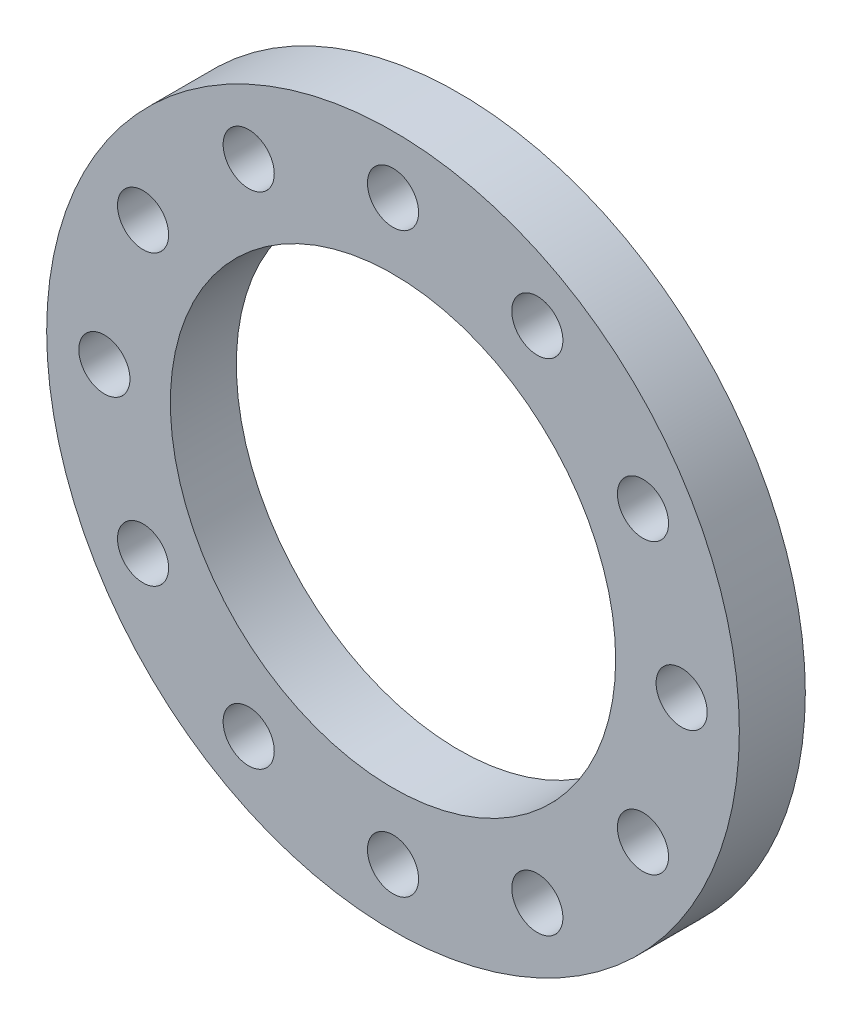
ISO-10303-21;
HEADER;
FILE_DESCRIPTION(('STEP AP214'),'2;1');
FILE_NAME('part.step','',(''),(''),'','','');
FILE_SCHEMA(('AUTOMOTIVE_DESIGN { 1 0 10303 214 1 1 1 1 }'));
ENDSEC;
DATA;
#1=APPLICATION_CONTEXT('core data for automotive mechanical design processes');
#2=APPLICATION_PROTOCOL_DEFINITION('international standard','automotive_design',2000,#1);
#3=PRODUCT_CONTEXT('',#1,'mechanical');
#4=PRODUCT('Part','Part','',(#3));
#5=PRODUCT_RELATED_PRODUCT_CATEGORY('part','',(#4));
#6=PRODUCT_DEFINITION_FORMATION('','',#4);
#7=PRODUCT_DEFINITION_CONTEXT('part definition',#1,'design');
#8=PRODUCT_DEFINITION('design','',#6,#7);
#9=PRODUCT_DEFINITION_SHAPE('','',#8);
#10=(LENGTH_UNIT() NAMED_UNIT(*) SI_UNIT(.MILLI.,.METRE.));
#11=(NAMED_UNIT(*) PLANE_ANGLE_UNIT() SI_UNIT($,.RADIAN.));
#12=(NAMED_UNIT(*) SI_UNIT($,.STERADIAN.) SOLID_ANGLE_UNIT());
#13=UNCERTAINTY_MEASURE_WITH_UNIT(LENGTH_MEASURE(1.E-05),#10,'distance_accuracy_value','');
#14=(GEOMETRIC_REPRESENTATION_CONTEXT(3) GLOBAL_UNCERTAINTY_ASSIGNED_CONTEXT((#13)) GLOBAL_UNIT_ASSIGNED_CONTEXT((#10,
#11,#12)) REPRESENTATION_CONTEXT('',''));
#15=CARTESIAN_POINT('',(0.,0.,0.));
#16=DIRECTION('',(0.,0.,1.));
#17=DIRECTION('',(1.,0.,0.));
#18=AXIS2_PLACEMENT_3D('',#15,#16,#17);
#19=CARTESIAN_POINT('',(0.,0.,4.));
#20=DIRECTION('',(0.,0.,1.));
#21=DIRECTION('',(1.,0.,0.));
#22=AXIS2_PLACEMENT_3D('',#19,#20,#21);
#23=PLANE('',#22);
#24=CARTESIAN_POINT('',(15.1554445662292,8.74999999999743,4.));
#25=DIRECTION('',(0.,0.,1.));
#26=DIRECTION('',(1.,0.,0.));
#27=AXIS2_PLACEMENT_3D('',#24,#25,#26);
#28=CIRCLE('',#27,1.55);
#29=CARTESIAN_POINT('',(16.7054445662292,8.74999999999743,4.));
#30=VERTEX_POINT('',#29);
#31=EDGE_CURVE('E132',#30,#30,#28,.T.);
#32=ORIENTED_EDGE('',*,*,#31,.F.);
#33=EDGE_LOOP('',(#32));
#34=FACE_BOUND('',#33,.T.);
#35=CARTESIAN_POINT('',(-15.1554445662262,-8.75000000000258,4.));
#36=DIRECTION('',(0.,0.,1.));
#37=DIRECTION('',(1.,0.,0.));
#38=AXIS2_PLACEMENT_3D('',#35,#36,#37);
#39=CIRCLE('',#38,1.55);
#40=CARTESIAN_POINT('',(-13.6054445662262,-8.75000000000258,4.));
#41=VERTEX_POINT('',#40);
#42=EDGE_CURVE('E117',#41,#41,#39,.T.);
#43=ORIENTED_EDGE('',*,*,#42,.F.);
#44=EDGE_LOOP('',(#43));
#45=FACE_BOUND('',#44,.T.);
#46=CARTESIAN_POINT('',(-15.1554445662247,8.75,4.));
#47=DIRECTION('',(0.,0.,1.));
#48=DIRECTION('',(1.,0.,0.));
#49=AXIS2_PLACEMENT_3D('',#46,#47,#48);
#50=CIRCLE('',#49,1.55);
#51=CARTESIAN_POINT('',(-13.6054445662247,8.75,4.));
#52=VERTEX_POINT('',#51);
#53=EDGE_CURVE('E101',#52,#52,#50,.T.);
#54=ORIENTED_EDGE('',*,*,#53,.F.);
#55=EDGE_LOOP('',(#54));
#56=FACE_BOUND('',#55,.T.);
#57=CARTESIAN_POINT('',(15.1554445662306,-8.75,4.));
#58=DIRECTION('',(0.,0.,1.));
#59=DIRECTION('',(1.,0.,0.));
#60=AXIS2_PLACEMENT_3D('',#57,#58,#59);
#61=CIRCLE('',#60,1.55);
#62=CARTESIAN_POINT('',(16.7054445662307,-8.75,4.));
#63=VERTEX_POINT('',#62);
#64=EDGE_CURVE('E88',#63,#63,#61,.T.);
#65=ORIENTED_EDGE('',*,*,#64,.F.);
#66=EDGE_LOOP('',(#65));
#67=FACE_BOUND('',#66,.T.);
#68=CARTESIAN_POINT('',(0.,-17.5,4.));
#69=DIRECTION('',(0.,0.,1.));
#70=DIRECTION('',(1.,0.,0.));
#71=AXIS2_PLACEMENT_3D('',#68,#69,#70);
#72=CIRCLE('',#71,1.55);
#73=CARTESIAN_POINT('',(1.55,-17.5,4.));
#74=VERTEX_POINT('',#73);
#75=EDGE_CURVE('E71',#74,#74,#72,.T.);
#76=ORIENTED_EDGE('',*,*,#75,.F.);
#77=EDGE_LOOP('',(#76));
#78=FACE_BOUND('',#77,.T.);
#79=CARTESIAN_POINT('',(0.,17.5,4.));
#80=DIRECTION('',(0.,0.,1.));
#81=DIRECTION('',(1.,0.,0.));
#82=AXIS2_PLACEMENT_3D('',#79,#80,#81);
#83=CIRCLE('',#82,1.55);
#84=CARTESIAN_POINT('',(1.55,17.5,4.));
#85=VERTEX_POINT('',#84);
#86=EDGE_CURVE('E53',#85,#85,#83,.T.);
#87=ORIENTED_EDGE('',*,*,#86,.F.);
#88=EDGE_LOOP('',(#87));
#89=FACE_BOUND('',#88,.T.);
#90=CARTESIAN_POINT('',(0.,0.,4.));
#91=DIRECTION('',(0.,0.,1.));
#92=DIRECTION('',(1.,0.,0.));
#93=AXIS2_PLACEMENT_3D('',#90,#91,#92);
#94=CIRCLE('',#93,21.);
#95=CARTESIAN_POINT('',(21.,0.,4.));
#96=VERTEX_POINT('',#95);
#97=EDGE_CURVE('E11',#96,#96,#94,.T.);
#98=ORIENTED_EDGE('',*,*,#97,.T.);
#99=EDGE_LOOP('',(#98));
#100=FACE_BOUND('',#99,.T.);
#101=CARTESIAN_POINT('',(0.,0.,4.));
#102=DIRECTION('',(0.,0.,1.));
#103=DIRECTION('',(1.,0.,0.));
#104=AXIS2_PLACEMENT_3D('',#101,#102,#103);
#105=CIRCLE('',#104,13.5);
#106=CARTESIAN_POINT('',(13.5,0.,4.));
#107=VERTEX_POINT('',#106);
#108=EDGE_CURVE('E47',#107,#107,#105,.T.);
#109=ORIENTED_EDGE('',*,*,#108,.F.);
#110=EDGE_LOOP('',(#109));
#111=FACE_BOUND('',#110,.T.);
#112=CARTESIAN_POINT('',(17.5,0.,4.));
#113=DIRECTION('',(0.,0.,1.));
#114=DIRECTION('',(1.,0.,0.));
#115=AXIS2_PLACEMENT_3D('',#112,#113,#114);
#116=CIRCLE('',#115,1.55);
#117=CARTESIAN_POINT('',(19.05,0.,4.));
#118=VERTEX_POINT('',#117);
#119=EDGE_CURVE('E65',#118,#118,#116,.T.);
#120=ORIENTED_EDGE('',*,*,#119,.F.);
#121=EDGE_LOOP('',(#120));
#122=FACE_BOUND('',#121,.T.);
#123=CARTESIAN_POINT('',(-17.5,0.,4.));
#124=DIRECTION('',(0.,0.,1.));
#125=DIRECTION('',(1.,0.,0.));
#126=AXIS2_PLACEMENT_3D('',#123,#124,#125);
#127=CIRCLE('',#126,1.55);
#128=CARTESIAN_POINT('',(-15.95,0.,4.));
#129=VERTEX_POINT('',#128);
#130=EDGE_CURVE('E78',#129,#129,#127,.T.);
#131=ORIENTED_EDGE('',*,*,#130,.F.);
#132=EDGE_LOOP('',(#131));
#133=FACE_BOUND('',#132,.T.);
#134=CARTESIAN_POINT('',(-8.74999999999703,-15.1554445662277,4.));
#135=DIRECTION('',(0.,0.,1.));
#136=DIRECTION('',(1.,0.,0.));
#137=AXIS2_PLACEMENT_3D('',#134,#135,#136);
#138=CIRCLE('',#137,1.55);
#139=CARTESIAN_POINT('',(-7.19999999999704,-15.1554445662277,4.));
#140=VERTEX_POINT('',#139);
#141=EDGE_CURVE('E94',#140,#140,#138,.T.);
#142=ORIENTED_EDGE('',*,*,#141,.F.);
#143=EDGE_LOOP('',(#142));
#144=FACE_BOUND('',#143,.T.);
#145=CARTESIAN_POINT('',(8.75000000000297,15.1554445662277,4.));
#146=DIRECTION('',(0.,0.,1.));
#147=DIRECTION('',(1.,0.,0.));
#148=AXIS2_PLACEMENT_3D('',#145,#146,#147);
#149=CIRCLE('',#148,1.55);
#150=CARTESIAN_POINT('',(10.300000000003,15.1554445662277,4.));
#151=VERTEX_POINT('',#150);
#152=EDGE_CURVE('E111',#151,#151,#149,.T.);
#153=ORIENTED_EDGE('',*,*,#152,.F.);
#154=EDGE_LOOP('',(#153));
#155=FACE_BOUND('',#154,.T.);
#156=CARTESIAN_POINT('',(-8.74999999999852,15.1554445662251,4.));
#157=DIRECTION('',(0.,0.,1.));
#158=DIRECTION('',(1.,0.,0.));
#159=AXIS2_PLACEMENT_3D('',#156,#157,#158);
#160=CIRCLE('',#159,1.54999999999999);
#161=CARTESIAN_POINT('',(-7.19999999999853,15.1554445662251,4.));
#162=VERTEX_POINT('',#161);
#163=EDGE_CURVE('E124',#162,#162,#160,.T.);
#164=ORIENTED_EDGE('',*,*,#163,.F.);
#165=EDGE_LOOP('',(#164));
#166=FACE_BOUND('',#165,.T.);
#167=CARTESIAN_POINT('',(8.75000000000149,-15.1554445662302,4.));
#168=DIRECTION('',(0.,0.,1.));
#169=DIRECTION('',(1.,0.,0.));
#170=AXIS2_PLACEMENT_3D('',#167,#168,#169);
#171=CIRCLE('',#170,1.55);
#172=CARTESIAN_POINT('',(10.3000000000015,-15.1554445662302,4.));
#173=VERTEX_POINT('',#172);
#174=EDGE_CURVE('E138',#173,#173,#171,.T.);
#175=ORIENTED_EDGE('',*,*,#174,.F.);
#176=EDGE_LOOP('',(#175));
#177=FACE_BOUND('',#176,.T.);
#178=ADVANCED_FACE('F35',(#34,#45,#56,#67,#78,#89,#100,#111,#122,#133,#144,#155,#166,#177),#23,.T.);
#179=CARTESIAN_POINT('',(0.,0.,0.));
#180=DIRECTION('',(0.,0.,1.));
#181=DIRECTION('',(1.,0.,0.));
#182=AXIS2_PLACEMENT_3D('',#179,#180,#181);
#183=PLANE('',#182);
#184=CARTESIAN_POINT('',(0.,0.,0.));
#185=DIRECTION('',(0.,0.,1.));
#186=DIRECTION('',(1.,0.,0.));
#187=AXIS2_PLACEMENT_3D('',#184,#185,#186);
#188=CIRCLE('',#187,21.);
#189=CARTESIAN_POINT('',(21.,0.,0.));
#190=VERTEX_POINT('',#189);
#191=EDGE_CURVE('E39',#190,#190,#188,.T.);
#192=ORIENTED_EDGE('',*,*,#191,.F.);
#193=EDGE_LOOP('',(#192));
#194=FACE_BOUND('',#193,.T.);
#195=CARTESIAN_POINT('',(0.,0.,0.));
#196=DIRECTION('',(0.,0.,1.));
#197=DIRECTION('',(1.,0.,0.));
#198=AXIS2_PLACEMENT_3D('',#195,#196,#197);
#199=CIRCLE('',#198,13.5);
#200=CARTESIAN_POINT('',(13.5,0.,0.));
#201=VERTEX_POINT('',#200);
#202=EDGE_CURVE('E49',#201,#201,#199,.T.);
#203=ORIENTED_EDGE('',*,*,#202,.T.);
#204=EDGE_LOOP('',(#203));
#205=FACE_BOUND('',#204,.T.);
#206=CARTESIAN_POINT('',(0.,17.5,0.));
#207=DIRECTION('',(0.,0.,1.));
#208=DIRECTION('',(1.,0.,0.));
#209=AXIS2_PLACEMENT_3D('',#206,#207,#208);
#210=CIRCLE('',#209,1.55);
#211=CARTESIAN_POINT('',(1.55,17.5,0.));
#212=VERTEX_POINT('',#211);
#213=EDGE_CURVE('E61',#212,#212,#210,.T.);
#214=ORIENTED_EDGE('',*,*,#213,.T.);
#215=EDGE_LOOP('',(#214));
#216=FACE_BOUND('',#215,.T.);
#217=CARTESIAN_POINT('',(17.5,0.,0.));
#218=DIRECTION('',(0.,0.,1.));
#219=DIRECTION('',(1.,0.,0.));
#220=AXIS2_PLACEMENT_3D('',#217,#218,#219);
#221=CIRCLE('',#220,1.55);
#222=CARTESIAN_POINT('',(19.05,0.,0.));
#223=VERTEX_POINT('',#222);
#224=EDGE_CURVE('E67',#223,#223,#221,.T.);
#225=ORIENTED_EDGE('',*,*,#224,.T.);
#226=EDGE_LOOP('',(#225));
#227=FACE_BOUND('',#226,.T.);
#228=CARTESIAN_POINT('',(0.,-17.5,0.));
#229=DIRECTION('',(0.,0.,1.));
#230=DIRECTION('',(1.,0.,0.));
#231=AXIS2_PLACEMENT_3D('',#228,#229,#230);
#232=CIRCLE('',#231,1.55);
#233=CARTESIAN_POINT('',(1.55,-17.5,0.));
#234=VERTEX_POINT('',#233);
#235=EDGE_CURVE('E74',#234,#234,#232,.T.);
#236=ORIENTED_EDGE('',*,*,#235,.T.);
#237=EDGE_LOOP('',(#236));
#238=FACE_BOUND('',#237,.T.);
#239=CARTESIAN_POINT('',(-17.5,0.,0.));
#240=DIRECTION('',(0.,0.,1.));
#241=DIRECTION('',(1.,0.,0.));
#242=AXIS2_PLACEMENT_3D('',#239,#240,#241);
#243=CIRCLE('',#242,1.55);
#244=CARTESIAN_POINT('',(-15.95,0.,0.));
#245=VERTEX_POINT('',#244);
#246=EDGE_CURVE('E84',#245,#245,#243,.T.);
#247=ORIENTED_EDGE('',*,*,#246,.T.);
#248=EDGE_LOOP('',(#247));
#249=FACE_BOUND('',#248,.T.);
#250=CARTESIAN_POINT('',(15.1554445662306,-8.75,0.));
#251=DIRECTION('',(0.,0.,1.));
#252=DIRECTION('',(1.,0.,0.));
#253=AXIS2_PLACEMENT_3D('',#250,#251,#252);
#254=CIRCLE('',#253,1.55);
#255=CARTESIAN_POINT('',(16.7054445662307,-8.75,0.));
#256=VERTEX_POINT('',#255);
#257=EDGE_CURVE('E90',#256,#256,#254,.T.);
#258=ORIENTED_EDGE('',*,*,#257,.T.);
#259=EDGE_LOOP('',(#258));
#260=FACE_BOUND('',#259,.T.);
#261=CARTESIAN_POINT('',(-8.74999999999703,-15.1554445662277,0.));
#262=DIRECTION('',(0.,0.,1.));
#263=DIRECTION('',(1.,0.,0.));
#264=AXIS2_PLACEMENT_3D('',#261,#262,#263);
#265=CIRCLE('',#264,1.55);
#266=CARTESIAN_POINT('',(-7.19999999999704,-15.1554445662277,0.));
#267=VERTEX_POINT('',#266);
#268=EDGE_CURVE('E97',#267,#267,#265,.T.);
#269=ORIENTED_EDGE('',*,*,#268,.T.);
#270=EDGE_LOOP('',(#269));
#271=FACE_BOUND('',#270,.T.);
#272=CARTESIAN_POINT('',(-15.1554445662247,8.75,0.));
#273=DIRECTION('',(0.,0.,1.));
#274=DIRECTION('',(1.,0.,0.));
#275=AXIS2_PLACEMENT_3D('',#272,#273,#274);
#276=CIRCLE('',#275,1.55);
#277=CARTESIAN_POINT('',(-13.6054445662247,8.75,0.));
#278=VERTEX_POINT('',#277);
#279=EDGE_CURVE('E107',#278,#278,#276,.T.);
#280=ORIENTED_EDGE('',*,*,#279,.T.);
#281=EDGE_LOOP('',(#280));
#282=FACE_BOUND('',#281,.T.);
#283=CARTESIAN_POINT('',(8.75000000000297,15.1554445662277,0.));
#284=DIRECTION('',(0.,0.,1.));
#285=DIRECTION('',(1.,0.,0.));
#286=AXIS2_PLACEMENT_3D('',#283,#284,#285);
#287=CIRCLE('',#286,1.55);
#288=CARTESIAN_POINT('',(10.300000000003,15.1554445662277,0.));
#289=VERTEX_POINT('',#288);
#290=EDGE_CURVE('E113',#289,#289,#287,.T.);
#291=ORIENTED_EDGE('',*,*,#290,.T.);
#292=EDGE_LOOP('',(#291));
#293=FACE_BOUND('',#292,.T.);
#294=CARTESIAN_POINT('',(-15.1554445662262,-8.75000000000258,0.));
#295=DIRECTION('',(0.,0.,1.));
#296=DIRECTION('',(1.,0.,0.));
#297=AXIS2_PLACEMENT_3D('',#294,#295,#296);
#298=CIRCLE('',#297,1.55);
#299=CARTESIAN_POINT('',(-13.6054445662262,-8.75000000000258,0.));
#300=VERTEX_POINT('',#299);
#301=EDGE_CURVE('E120',#300,#300,#298,.T.);
#302=ORIENTED_EDGE('',*,*,#301,.T.);
#303=EDGE_LOOP('',(#302));
#304=FACE_BOUND('',#303,.T.);
#305=CARTESIAN_POINT('',(-8.74999999999852,15.1554445662251,0.));
#306=DIRECTION('',(0.,0.,1.));
#307=DIRECTION('',(1.,0.,0.));
#308=AXIS2_PLACEMENT_3D('',#305,#306,#307);
#309=CIRCLE('',#308,1.54999999999999);
#310=CARTESIAN_POINT('',(-7.19999999999853,15.1554445662251,0.));
#311=VERTEX_POINT('',#310);
#312=EDGE_CURVE('E128',#311,#311,#309,.T.);
#313=ORIENTED_EDGE('',*,*,#312,.T.);
#314=EDGE_LOOP('',(#313));
#315=FACE_BOUND('',#314,.T.);
#316=CARTESIAN_POINT('',(15.1554445662292,8.74999999999743,0.));
#317=DIRECTION('',(0.,0.,1.));
#318=DIRECTION('',(1.,0.,0.));
#319=AXIS2_PLACEMENT_3D('',#316,#317,#318);
#320=CIRCLE('',#319,1.55);
#321=CARTESIAN_POINT('',(16.7054445662292,8.74999999999743,0.));
#322=VERTEX_POINT('',#321);
#323=EDGE_CURVE('E134',#322,#322,#320,.T.);
#324=ORIENTED_EDGE('',*,*,#323,.T.);
#325=EDGE_LOOP('',(#324));
#326=FACE_BOUND('',#325,.T.);
#327=CARTESIAN_POINT('',(8.75000000000149,-15.1554445662302,0.));
#328=DIRECTION('',(0.,0.,1.));
#329=DIRECTION('',(1.,0.,0.));
#330=AXIS2_PLACEMENT_3D('',#327,#328,#329);
#331=CIRCLE('',#330,1.55);
#332=CARTESIAN_POINT('',(10.3000000000015,-15.1554445662302,0.));
#333=VERTEX_POINT('',#332);
#334=EDGE_CURVE('E140',#333,#333,#331,.T.);
#335=ORIENTED_EDGE('',*,*,#334,.T.);
#336=EDGE_LOOP('',(#335));
#337=FACE_BOUND('',#336,.T.);
#338=ADVANCED_FACE('F151',(#194,#205,#216,#227,#238,#249,#260,#271,#282,#293,#304,#315,#326,
#337),#183,.F.);
#339=CARTESIAN_POINT('',(0.,0.,4.));
#340=DIRECTION('',(0.,0.,-1.));
#341=DIRECTION('',(-1.,0.,0.));
#342=AXIS2_PLACEMENT_3D('',#339,#340,#341);
#343=CYLINDRICAL_SURFACE('',#342,21.);
#344=ORIENTED_EDGE('',*,*,#97,.F.);
#345=EDGE_LOOP('',(#344));
#346=FACE_BOUND('',#345,.T.);
#347=ORIENTED_EDGE('',*,*,#191,.T.);
#348=EDGE_LOOP('',(#347));
#349=FACE_BOUND('',#348,.T.);
#350=ADVANCED_FACE('F37',(#346,#349),#343,.T.);
#351=CARTESIAN_POINT('',(0.,0.,4.));
#352=DIRECTION('',(0.,0.,-1.));
#353=DIRECTION('',(-1.,0.,0.));
#354=AXIS2_PLACEMENT_3D('',#351,#352,#353);
#355=CYLINDRICAL_SURFACE('',#354,13.5);
#356=ORIENTED_EDGE('',*,*,#108,.T.);
#357=EDGE_LOOP('',(#356));
#358=FACE_BOUND('',#357,.T.);
#359=ORIENTED_EDGE('',*,*,#202,.F.);
#360=EDGE_LOOP('',(#359));
#361=FACE_BOUND('',#360,.T.);
#362=ADVANCED_FACE('F161',(#358,#361),#355,.F.);
#363=CARTESIAN_POINT('',(0.,17.5,4.));
#364=DIRECTION('',(0.,0.,-1.));
#365=DIRECTION('',(-1.,0.,0.));
#366=AXIS2_PLACEMENT_3D('',#363,#364,#365);
#367=CYLINDRICAL_SURFACE('',#366,1.55);
#368=ORIENTED_EDGE('',*,*,#86,.T.);
#369=EDGE_LOOP('',(#368));
#370=FACE_BOUND('',#369,.T.);
#371=ORIENTED_EDGE('',*,*,#213,.F.);
#372=EDGE_LOOP('',(#371));
#373=FACE_BOUND('',#372,.T.);
#374=ADVANCED_FACE('F164',(#370,#373),#367,.F.);
#375=CARTESIAN_POINT('',(17.5,0.,4.));
#376=DIRECTION('',(0.,0.,-1.));
#377=DIRECTION('',(-1.,0.,0.));
#378=AXIS2_PLACEMENT_3D('',#375,#376,#377);
#379=CYLINDRICAL_SURFACE('',#378,1.55);
#380=ORIENTED_EDGE('',*,*,#119,.T.);
#381=EDGE_LOOP('',(#380));
#382=FACE_BOUND('',#381,.T.);
#383=ORIENTED_EDGE('',*,*,#224,.F.);
#384=EDGE_LOOP('',(#383));
#385=FACE_BOUND('',#384,.T.);
#386=ADVANCED_FACE('F168',(#382,#385),#379,.F.);
#387=CARTESIAN_POINT('',(0.,-17.5,4.));
#388=DIRECTION('',(0.,0.,-1.));
#389=DIRECTION('',(-1.,0.,0.));
#390=AXIS2_PLACEMENT_3D('',#387,#388,#389);
#391=CYLINDRICAL_SURFACE('',#390,1.55);
#392=ORIENTED_EDGE('',*,*,#75,.T.);
#393=EDGE_LOOP('',(#392));
#394=FACE_BOUND('',#393,.T.);
#395=ORIENTED_EDGE('',*,*,#235,.F.);
#396=EDGE_LOOP('',(#395));
#397=FACE_BOUND('',#396,.T.);
#398=ADVANCED_FACE('F172',(#394,#397),#391,.F.);
#399=CARTESIAN_POINT('',(-17.5,0.,4.));
#400=DIRECTION('',(0.,0.,-1.));
#401=DIRECTION('',(-1.,0.,0.));
#402=AXIS2_PLACEMENT_3D('',#399,#400,#401);
#403=CYLINDRICAL_SURFACE('',#402,1.55);
#404=ORIENTED_EDGE('',*,*,#130,.T.);
#405=EDGE_LOOP('',(#404));
#406=FACE_BOUND('',#405,.T.);
#407=ORIENTED_EDGE('',*,*,#246,.F.);
#408=EDGE_LOOP('',(#407));
#409=FACE_BOUND('',#408,.T.);
#410=ADVANCED_FACE('F176',(#406,#409),#403,.F.);
#411=CARTESIAN_POINT('',(15.1554445662306,-8.75,4.));
#412=DIRECTION('',(0.,0.,-1.));
#413=DIRECTION('',(-1.,0.,0.));
#414=AXIS2_PLACEMENT_3D('',#411,#412,#413);
#415=CYLINDRICAL_SURFACE('',#414,1.55);
#416=ORIENTED_EDGE('',*,*,#64,.T.);
#417=EDGE_LOOP('',(#416));
#418=FACE_BOUND('',#417,.T.);
#419=ORIENTED_EDGE('',*,*,#257,.F.);
#420=EDGE_LOOP('',(#419));
#421=FACE_BOUND('',#420,.T.);
#422=ADVANCED_FACE('F180',(#418,#421),#415,.F.);
#423=CARTESIAN_POINT('',(-8.74999999999703,-15.1554445662277,4.));
#424=DIRECTION('',(0.,0.,-1.));
#425=DIRECTION('',(-1.,0.,0.));
#426=AXIS2_PLACEMENT_3D('',#423,#424,#425);
#427=CYLINDRICAL_SURFACE('',#426,1.55);
#428=ORIENTED_EDGE('',*,*,#141,.T.);
#429=EDGE_LOOP('',(#428));
#430=FACE_BOUND('',#429,.T.);
#431=ORIENTED_EDGE('',*,*,#268,.F.);
#432=EDGE_LOOP('',(#431));
#433=FACE_BOUND('',#432,.T.);
#434=ADVANCED_FACE('F184',(#430,#433),#427,.F.);
#435=CARTESIAN_POINT('',(-15.1554445662247,8.75,4.));
#436=DIRECTION('',(0.,0.,-1.));
#437=DIRECTION('',(-1.,0.,0.));
#438=AXIS2_PLACEMENT_3D('',#435,#436,#437);
#439=CYLINDRICAL_SURFACE('',#438,1.55);
#440=ORIENTED_EDGE('',*,*,#53,.T.);
#441=EDGE_LOOP('',(#440));
#442=FACE_BOUND('',#441,.T.);
#443=ORIENTED_EDGE('',*,*,#279,.F.);
#444=EDGE_LOOP('',(#443));
#445=FACE_BOUND('',#444,.T.);
#446=ADVANCED_FACE('F188',(#442,#445),#439,.F.);
#447=CARTESIAN_POINT('',(8.75000000000297,15.1554445662277,4.));
#448=DIRECTION('',(0.,0.,-1.));
#449=DIRECTION('',(-1.,0.,0.));
#450=AXIS2_PLACEMENT_3D('',#447,#448,#449);
#451=CYLINDRICAL_SURFACE('',#450,1.55);
#452=ORIENTED_EDGE('',*,*,#152,.T.);
#453=EDGE_LOOP('',(#452));
#454=FACE_BOUND('',#453,.T.);
#455=ORIENTED_EDGE('',*,*,#290,.F.);
#456=EDGE_LOOP('',(#455));
#457=FACE_BOUND('',#456,.T.);
#458=ADVANCED_FACE('F192',(#454,#457),#451,.F.);
#459=CARTESIAN_POINT('',(-15.1554445662262,-8.75000000000258,4.));
#460=DIRECTION('',(0.,0.,-1.));
#461=DIRECTION('',(-1.,0.,0.));
#462=AXIS2_PLACEMENT_3D('',#459,#460,#461);
#463=CYLINDRICAL_SURFACE('',#462,1.55);
#464=ORIENTED_EDGE('',*,*,#42,.T.);
#465=EDGE_LOOP('',(#464));
#466=FACE_BOUND('',#465,.T.);
#467=ORIENTED_EDGE('',*,*,#301,.F.);
#468=EDGE_LOOP('',(#467));
#469=FACE_BOUND('',#468,.T.);
#470=ADVANCED_FACE('F196',(#466,#469),#463,.F.);
#471=CARTESIAN_POINT('',(-8.74999999999852,15.1554445662251,4.));
#472=DIRECTION('',(0.,0.,-1.));
#473=DIRECTION('',(-1.,0.,0.));
#474=AXIS2_PLACEMENT_3D('',#471,#472,#473);
#475=CYLINDRICAL_SURFACE('',#474,1.54999999999999);
#476=ORIENTED_EDGE('',*,*,#163,.T.);
#477=EDGE_LOOP('',(#476));
#478=FACE_BOUND('',#477,.T.);
#479=ORIENTED_EDGE('',*,*,#312,.F.);
#480=EDGE_LOOP('',(#479));
#481=FACE_BOUND('',#480,.T.);
#482=ADVANCED_FACE('F200',(#478,#481),#475,.F.);
#483=CARTESIAN_POINT('',(15.1554445662292,8.74999999999743,4.));
#484=DIRECTION('',(0.,0.,-1.));
#485=DIRECTION('',(-1.,0.,0.));
#486=AXIS2_PLACEMENT_3D('',#483,#484,#485);
#487=CYLINDRICAL_SURFACE('',#486,1.55);
#488=ORIENTED_EDGE('',*,*,#31,.T.);
#489=EDGE_LOOP('',(#488));
#490=FACE_BOUND('',#489,.T.);
#491=ORIENTED_EDGE('',*,*,#323,.F.);
#492=EDGE_LOOP('',(#491));
#493=FACE_BOUND('',#492,.T.);
#494=ADVANCED_FACE('F204',(#490,#493),#487,.F.);
#495=CARTESIAN_POINT('',(8.75000000000149,-15.1554445662302,4.));
#496=DIRECTION('',(0.,0.,-1.));
#497=DIRECTION('',(-1.,0.,0.));
#498=AXIS2_PLACEMENT_3D('',#495,#496,#497);
#499=CYLINDRICAL_SURFACE('',#498,1.55);
#500=ORIENTED_EDGE('',*,*,#174,.T.);
#501=EDGE_LOOP('',(#500));
#502=FACE_BOUND('',#501,.T.);
#503=ORIENTED_EDGE('',*,*,#334,.F.);
#504=EDGE_LOOP('',(#503));
#505=FACE_BOUND('',#504,.T.);
#506=ADVANCED_FACE('F147',(#502,#505),#499,.F.);
#507=CLOSED_SHELL('',(#178,#338,#350,#362,#374,#386,#398,#410,#422,#434,#446,#458,#470,#482,
#494,#506));
#508=MANIFOLD_SOLID_BREP('B2',#507);
#509=ADVANCED_BREP_SHAPE_REPRESENTATION('',(#18,#508),#14);
#510=SHAPE_DEFINITION_REPRESENTATION(#9,#509);
ENDSEC;
END-ISO-10303-21;
